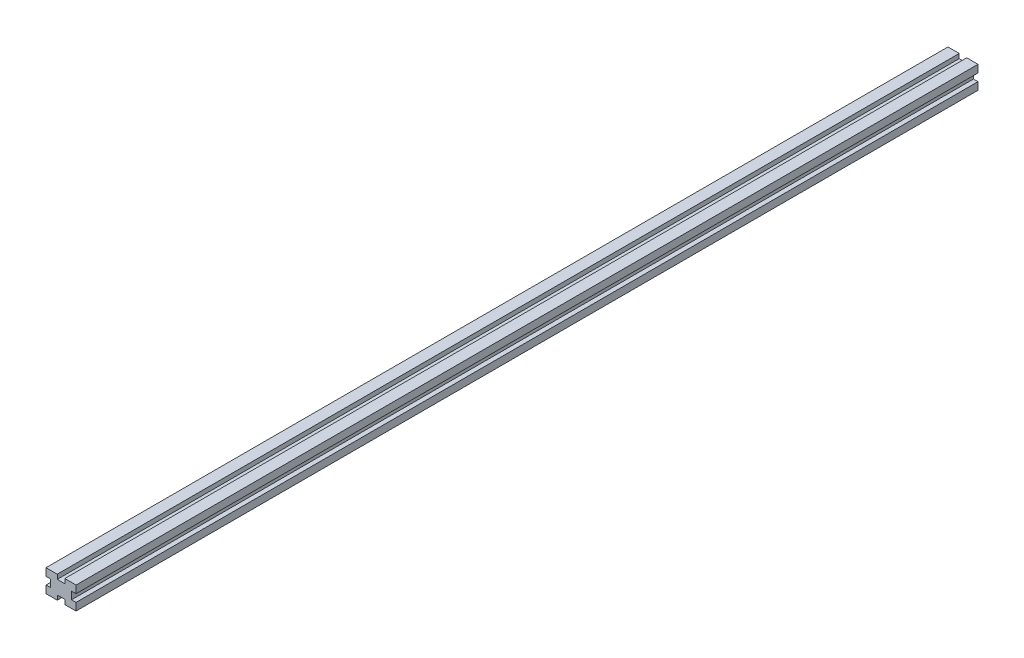
ISO-10303-21;
HEADER;
FILE_DESCRIPTION(('STEP AP214'),'2;1');
FILE_NAME('part.step','',(''),(''),'','','');
FILE_SCHEMA(('AUTOMOTIVE_DESIGN { 1 0 10303 214 1 1 1 1 }'));
ENDSEC;
DATA;
#1=APPLICATION_CONTEXT('core data for automotive mechanical design processes');
#2=APPLICATION_PROTOCOL_DEFINITION('international standard','automotive_design',2000,#1);
#3=PRODUCT_CONTEXT('',#1,'mechanical');
#4=PRODUCT('Part','Part','',(#3));
#5=PRODUCT_RELATED_PRODUCT_CATEGORY('part','',(#4));
#6=PRODUCT_DEFINITION_FORMATION('','',#4);
#7=PRODUCT_DEFINITION_CONTEXT('part definition',#1,'design');
#8=PRODUCT_DEFINITION('design','',#6,#7);
#9=PRODUCT_DEFINITION_SHAPE('','',#8);
#10=(LENGTH_UNIT() NAMED_UNIT(*) SI_UNIT(.MILLI.,.METRE.));
#11=(NAMED_UNIT(*) PLANE_ANGLE_UNIT() SI_UNIT($,.RADIAN.));
#12=(NAMED_UNIT(*) SI_UNIT($,.STERADIAN.) SOLID_ANGLE_UNIT());
#13=UNCERTAINTY_MEASURE_WITH_UNIT(LENGTH_MEASURE(1.E-05),#10,'distance_accuracy_value','');
#14=(GEOMETRIC_REPRESENTATION_CONTEXT(3) GLOBAL_UNCERTAINTY_ASSIGNED_CONTEXT((#13)) GLOBAL_UNIT_ASSIGNED_CONTEXT((#10,
#11,#12)) REPRESENTATION_CONTEXT('',''));
#15=CARTESIAN_POINT('',(0.,0.,0.));
#16=DIRECTION('',(0.,0.,1.));
#17=DIRECTION('',(1.,0.,0.));
#18=AXIS2_PLACEMENT_3D('',#15,#16,#17);
#19=CARTESIAN_POINT('',(0.,0.,600.));
#20=DIRECTION('',(1.,0.,0.));
#21=DIRECTION('',(0.,0.,-1.));
#22=AXIS2_PLACEMENT_3D('',#19,#20,#21);
#23=PLANE('',#22);
#24=DIRECTION('',(0.,-1.,0.));
#25=VECTOR('',#24,1.);
#26=CARTESIAN_POINT('',(0.,0.,0.));
#27=LINE('',#26,#25);
#28=CARTESIAN_POINT('',(0.,15.,0.));
#29=VERTEX_POINT('',#28);
#30=CARTESIAN_POINT('',(0.,10.,0.));
#31=VERTEX_POINT('',#30);
#32=EDGE_CURVE('E206',#29,#31,#27,.T.);
#33=ORIENTED_EDGE('',*,*,#32,.T.);
#34=DIRECTION('',(0.,0.,1.));
#35=VECTOR('',#34,1.);
#36=CARTESIAN_POINT('',(0.,10.,-100.));
#37=LINE('',#36,#35);
#38=CARTESIAN_POINT('',(0.,10.,600.));
#39=VERTEX_POINT('',#38);
#40=EDGE_CURVE('E325',#31,#39,#37,.T.);
#41=ORIENTED_EDGE('',*,*,#40,.T.);
#42=DIRECTION('',(0.,-1.,0.));
#43=VECTOR('',#42,1.);
#44=CARTESIAN_POINT('',(0.,0.,600.));
#45=LINE('',#44,#43);
#46=CARTESIAN_POINT('',(0.,15.,600.));
#47=VERTEX_POINT('',#46);
#48=EDGE_CURVE('E284',#47,#39,#45,.T.);
#49=ORIENTED_EDGE('',*,*,#48,.F.);
#50=DIRECTION('',(0.,0.,-1.));
#51=VECTOR('',#50,1.);
#52=CARTESIAN_POINT('',(0.,15.,600.));
#53=LINE('',#52,#51);
#54=EDGE_CURVE('E205',#47,#29,#53,.T.);
#55=ORIENTED_EDGE('',*,*,#54,.T.);
#56=EDGE_LOOP('',(#33,#41,#49,#55));
#57=FACE_BOUND('',#56,.T.);
#58=ADVANCED_FACE('F33',(#57),#23,.F.);
#59=CARTESIAN_POINT('',(0.,0.,600.));
#60=DIRECTION('',(0.,1.,0.));
#61=DIRECTION('',(0.,0.,1.));
#62=AXIS2_PLACEMENT_3D('',#59,#60,#61);
#63=PLANE('',#62);
#64=DIRECTION('',(1.,0.,0.));
#65=VECTOR('',#64,1.);
#66=CARTESIAN_POINT('',(0.,0.,600.));
#67=LINE('',#66,#65);
#68=CARTESIAN_POINT('',(12.5,0.,600.));
#69=VERTEX_POINT('',#68);
#70=CARTESIAN_POINT('',(20.,0.,600.));
#71=VERTEX_POINT('',#70);
#72=EDGE_CURVE('E199',#69,#71,#67,.T.);
#73=ORIENTED_EDGE('',*,*,#72,.F.);
#74=DIRECTION('',(0.,0.,1.));
#75=VECTOR('',#74,1.);
#76=CARTESIAN_POINT('',(12.5,0.,-100.));
#77=LINE('',#76,#75);
#78=CARTESIAN_POINT('',(12.5,0.,0.));
#79=VERTEX_POINT('',#78);
#80=EDGE_CURVE('E188',#79,#69,#77,.T.);
#81=ORIENTED_EDGE('',*,*,#80,.F.);
#82=DIRECTION('',(1.,0.,0.));
#83=VECTOR('',#82,1.);
#84=CARTESIAN_POINT('',(0.,0.,0.));
#85=LINE('',#84,#83);
#86=CARTESIAN_POINT('',(20.,0.,0.));
#87=VERTEX_POINT('',#86);
#88=EDGE_CURVE('E209',#79,#87,#85,.T.);
#89=ORIENTED_EDGE('',*,*,#88,.T.);
#90=DIRECTION('',(0.,0.,-1.));
#91=VECTOR('',#90,1.);
#92=CARTESIAN_POINT('',(20.,0.,600.));
#93=LINE('',#92,#91);
#94=EDGE_CURVE('E226',#71,#87,#93,.T.);
#95=ORIENTED_EDGE('',*,*,#94,.F.);
#96=EDGE_LOOP('',(#73,#81,#89,#95));
#97=FACE_BOUND('',#96,.T.);
#98=ADVANCED_FACE('F358',(#97),#63,.F.);
#99=CARTESIAN_POINT('',(20.,0.,600.));
#100=DIRECTION('',(-1.,0.,0.));
#101=DIRECTION('',(0.,0.,1.));
#102=AXIS2_PLACEMENT_3D('',#99,#100,#101);
#103=PLANE('',#102);
#104=DIRECTION('',(0.,1.,0.));
#105=VECTOR('',#104,1.);
#106=CARTESIAN_POINT('',(20.,0.,0.));
#107=LINE('',#106,#105);
#108=CARTESIAN_POINT('',(20.,5.,0.));
#109=VERTEX_POINT('',#108);
#110=EDGE_CURVE('E215',#87,#109,#107,.T.);
#111=ORIENTED_EDGE('',*,*,#110,.T.);
#112=DIRECTION('',(0.,0.,1.));
#113=VECTOR('',#112,1.);
#114=CARTESIAN_POINT('',(20.,5.,-100.));
#115=LINE('',#114,#113);
#116=CARTESIAN_POINT('',(20.,5.,600.));
#117=VERTEX_POINT('',#116);
#118=EDGE_CURVE('E334',#109,#117,#115,.T.);
#119=ORIENTED_EDGE('',*,*,#118,.T.);
#120=DIRECTION('',(0.,1.,0.));
#121=VECTOR('',#120,1.);
#122=CARTESIAN_POINT('',(20.,0.,600.));
#123=LINE('',#122,#121);
#124=EDGE_CURVE('E194',#71,#117,#123,.T.);
#125=ORIENTED_EDGE('',*,*,#124,.F.);
#126=ORIENTED_EDGE('',*,*,#94,.T.);
#127=EDGE_LOOP('',(#111,#119,#125,#126));
#128=FACE_BOUND('',#127,.T.);
#129=ADVANCED_FACE('F361',(#128),#103,.F.);
#130=CARTESIAN_POINT('',(0.,15.,600.));
#131=DIRECTION('',(0.,-1.,0.));
#132=DIRECTION('',(0.,0.,-1.));
#133=AXIS2_PLACEMENT_3D('',#130,#131,#132);
#134=PLANE('',#133);
#135=DIRECTION('',(-1.,0.,0.));
#136=VECTOR('',#135,1.);
#137=CARTESIAN_POINT('',(0.,15.,600.));
#138=LINE('',#137,#136);
#139=CARTESIAN_POINT('',(7.5,15.,600.));
#140=VERTEX_POINT('',#139);
#141=EDGE_CURVE('E197',#140,#47,#138,.T.);
#142=ORIENTED_EDGE('',*,*,#141,.F.);
#143=DIRECTION('',(0.,0.,1.));
#144=VECTOR('',#143,1.);
#145=CARTESIAN_POINT('',(7.5,15.,-100.));
#146=LINE('',#145,#144);
#147=CARTESIAN_POINT('',(7.5,15.,0.));
#148=VERTEX_POINT('',#147);
#149=EDGE_CURVE('E281',#148,#140,#146,.T.);
#150=ORIENTED_EDGE('',*,*,#149,.F.);
#151=DIRECTION('',(-1.,0.,0.));
#152=VECTOR('',#151,1.);
#153=CARTESIAN_POINT('',(0.,15.,0.));
#154=LINE('',#153,#152);
#155=EDGE_CURVE('E218',#148,#29,#154,.T.);
#156=ORIENTED_EDGE('',*,*,#155,.T.);
#157=ORIENTED_EDGE('',*,*,#54,.F.);
#158=EDGE_LOOP('',(#142,#150,#156,#157));
#159=FACE_BOUND('',#158,.T.);
#160=ADVANCED_FACE('F384',(#159),#134,.F.);
#161=CARTESIAN_POINT('',(0.,5.,600.));
#162=VERTEX_POINT('',#161);
#163=CARTESIAN_POINT('',(0.,0.,600.));
#164=VERTEX_POINT('',#163);
#165=EDGE_CURVE('E222',#162,#164,#45,.T.);
#166=ORIENTED_EDGE('',*,*,#165,.F.);
#167=DIRECTION('',(0.,0.,1.));
#168=VECTOR('',#167,1.);
#169=CARTESIAN_POINT('',(0.,5.,-100.));
#170=LINE('',#169,#168);
#171=CARTESIAN_POINT('',(0.,5.,0.));
#172=VERTEX_POINT('',#171);
#173=EDGE_CURVE('E304',#172,#162,#170,.T.);
#174=ORIENTED_EDGE('',*,*,#173,.F.);
#175=CARTESIAN_POINT('',(0.,0.,0.));
#176=VERTEX_POINT('',#175);
#177=EDGE_CURVE('E210',#172,#176,#27,.T.);
#178=ORIENTED_EDGE('',*,*,#177,.T.);
#179=DIRECTION('',(0.,0.,-1.));
#180=VECTOR('',#179,1.);
#181=CARTESIAN_POINT('',(0.,0.,600.));
#182=LINE('',#181,#180);
#183=EDGE_CURVE('E229',#164,#176,#182,.T.);
#184=ORIENTED_EDGE('',*,*,#183,.F.);
#185=EDGE_LOOP('',(#166,#174,#178,#184));
#186=FACE_BOUND('',#185,.T.);
#187=ADVANCED_FACE('F35',(#186),#23,.F.);
#188=CARTESIAN_POINT('',(7.5,0.,0.));
#189=VERTEX_POINT('',#188);
#190=EDGE_CURVE('E211',#176,#189,#85,.T.);
#191=ORIENTED_EDGE('',*,*,#190,.T.);
#192=DIRECTION('',(0.,0.,1.));
#193=VECTOR('',#192,1.);
#194=CARTESIAN_POINT('',(7.5,0.,-100.));
#195=LINE('',#194,#193);
#196=CARTESIAN_POINT('',(7.5,0.,600.));
#197=VERTEX_POINT('',#196);
#198=EDGE_CURVE('E301',#189,#197,#195,.T.);
#199=ORIENTED_EDGE('',*,*,#198,.T.);
#200=EDGE_CURVE('E195',#164,#197,#67,.T.);
#201=ORIENTED_EDGE('',*,*,#200,.F.);
#202=ORIENTED_EDGE('',*,*,#183,.T.);
#203=EDGE_LOOP('',(#191,#199,#201,#202));
#204=FACE_BOUND('',#203,.T.);
#205=ADVANCED_FACE('F300',(#204),#63,.F.);
#206=CARTESIAN_POINT('',(20.,10.,600.));
#207=VERTEX_POINT('',#206);
#208=CARTESIAN_POINT('',(20.,15.,600.));
#209=VERTEX_POINT('',#208);
#210=EDGE_CURVE('E183',#207,#209,#123,.T.);
#211=ORIENTED_EDGE('',*,*,#210,.F.);
#212=DIRECTION('',(0.,0.,1.));
#213=VECTOR('',#212,1.);
#214=CARTESIAN_POINT('',(20.,10.,-100.));
#215=LINE('',#214,#213);
#216=CARTESIAN_POINT('',(20.,10.,0.));
#217=VERTEX_POINT('',#216);
#218=EDGE_CURVE('E167',#217,#207,#215,.T.);
#219=ORIENTED_EDGE('',*,*,#218,.F.);
#220=CARTESIAN_POINT('',(20.,15.,0.));
#221=VERTEX_POINT('',#220);
#222=EDGE_CURVE('E214',#217,#221,#107,.T.);
#223=ORIENTED_EDGE('',*,*,#222,.T.);
#224=DIRECTION('',(0.,0.,-1.));
#225=VECTOR('',#224,1.);
#226=CARTESIAN_POINT('',(20.,15.,600.));
#227=LINE('',#226,#225);
#228=EDGE_CURVE('E192',#209,#221,#227,.T.);
#229=ORIENTED_EDGE('',*,*,#228,.F.);
#230=EDGE_LOOP('',(#211,#219,#223,#229));
#231=FACE_BOUND('',#230,.T.);
#232=ADVANCED_FACE('F190',(#231),#103,.F.);
#233=CARTESIAN_POINT('',(12.5,15.,0.));
#234=VERTEX_POINT('',#233);
#235=EDGE_CURVE('E219',#221,#234,#154,.T.);
#236=ORIENTED_EDGE('',*,*,#235,.T.);
#237=DIRECTION('',(0.,0.,1.));
#238=VECTOR('',#237,1.);
#239=CARTESIAN_POINT('',(12.5,15.,-100.));
#240=LINE('',#239,#238);
#241=CARTESIAN_POINT('',(12.5,15.,600.));
#242=VERTEX_POINT('',#241);
#243=EDGE_CURVE('E265',#234,#242,#240,.T.);
#244=ORIENTED_EDGE('',*,*,#243,.T.);
#245=EDGE_CURVE('E203',#209,#242,#138,.T.);
#246=ORIENTED_EDGE('',*,*,#245,.F.);
#247=ORIENTED_EDGE('',*,*,#228,.T.);
#248=EDGE_LOOP('',(#236,#244,#246,#247));
#249=FACE_BOUND('',#248,.T.);
#250=ADVANCED_FACE('F263',(#249),#134,.F.);
#251=CARTESIAN_POINT('',(0.,0.,600.));
#252=DIRECTION('',(0.,0.,-1.));
#253=DIRECTION('',(-1.,0.,0.));
#254=AXIS2_PLACEMENT_3D('',#251,#252,#253);
#255=PLANE('',#254);
#256=ORIENTED_EDGE('',*,*,#124,.T.);
#257=DIRECTION('',(1.,0.,0.));
#258=VECTOR('',#257,1.);
#259=CARTESIAN_POINT('',(20.,5.,600.));
#260=LINE('',#259,#258);
#261=CARTESIAN_POINT('',(17.,5.,600.));
#262=VERTEX_POINT('',#261);
#263=EDGE_CURVE('E177',#262,#117,#260,.T.);
#264=ORIENTED_EDGE('',*,*,#263,.F.);
#265=DIRECTION('',(0.,-1.,0.));
#266=VECTOR('',#265,1.);
#267=CARTESIAN_POINT('',(17.,10.,600.));
#268=LINE('',#267,#266);
#269=CARTESIAN_POINT('',(17.,10.,600.));
#270=VERTEX_POINT('',#269);
#271=EDGE_CURVE('E187',#270,#262,#268,.T.);
#272=ORIENTED_EDGE('',*,*,#271,.F.);
#273=DIRECTION('',(-1.,0.,0.));
#274=VECTOR('',#273,1.);
#275=CARTESIAN_POINT('',(20.,10.,600.));
#276=LINE('',#275,#274);
#277=EDGE_CURVE('E170',#207,#270,#276,.T.);
#278=ORIENTED_EDGE('',*,*,#277,.F.);
#279=ORIENTED_EDGE('',*,*,#210,.T.);
#280=ORIENTED_EDGE('',*,*,#245,.T.);
#281=DIRECTION('',(0.,1.,0.));
#282=VECTOR('',#281,1.);
#283=CARTESIAN_POINT('',(12.5,15.,600.));
#284=LINE('',#283,#282);
#285=CARTESIAN_POINT('',(12.5,12.,600.));
#286=VERTEX_POINT('',#285);
#287=EDGE_CURVE('E268',#286,#242,#284,.T.);
#288=ORIENTED_EDGE('',*,*,#287,.F.);
#289=DIRECTION('',(1.,0.,0.));
#290=VECTOR('',#289,1.);
#291=CARTESIAN_POINT('',(7.5,12.,600.));
#292=LINE('',#291,#290);
#293=CARTESIAN_POINT('',(7.5,12.,600.));
#294=VERTEX_POINT('',#293);
#295=EDGE_CURVE('E271',#294,#286,#292,.T.);
#296=ORIENTED_EDGE('',*,*,#295,.F.);
#297=DIRECTION('',(0.,-1.,0.));
#298=VECTOR('',#297,1.);
#299=CARTESIAN_POINT('',(7.5,15.,600.));
#300=LINE('',#299,#298);
#301=EDGE_CURVE('E277',#140,#294,#300,.T.);
#302=ORIENTED_EDGE('',*,*,#301,.F.);
#303=ORIENTED_EDGE('',*,*,#141,.T.);
#304=ORIENTED_EDGE('',*,*,#48,.T.);
#305=DIRECTION('',(-1.,0.,0.));
#306=VECTOR('',#305,1.);
#307=CARTESIAN_POINT('',(0.,10.,600.));
#308=LINE('',#307,#306);
#309=CARTESIAN_POINT('',(3.,10.,600.));
#310=VERTEX_POINT('',#309);
#311=EDGE_CURVE('E323',#310,#39,#308,.T.);
#312=ORIENTED_EDGE('',*,*,#311,.F.);
#313=DIRECTION('',(0.,1.,0.));
#314=VECTOR('',#313,1.);
#315=CARTESIAN_POINT('',(3.,5.,600.));
#316=LINE('',#315,#314);
#317=CARTESIAN_POINT('',(3.,5.,600.));
#318=VERTEX_POINT('',#317);
#319=EDGE_CURVE('E320',#318,#310,#316,.T.);
#320=ORIENTED_EDGE('',*,*,#319,.F.);
#321=DIRECTION('',(1.,0.,0.));
#322=VECTOR('',#321,1.);
#323=CARTESIAN_POINT('',(0.,5.,600.));
#324=LINE('',#323,#322);
#325=EDGE_CURVE('E294',#162,#318,#324,.T.);
#326=ORIENTED_EDGE('',*,*,#325,.F.);
#327=ORIENTED_EDGE('',*,*,#165,.T.);
#328=ORIENTED_EDGE('',*,*,#200,.T.);
#329=DIRECTION('',(0.,-1.,0.));
#330=VECTOR('',#329,1.);
#331=CARTESIAN_POINT('',(7.5,0.,600.));
#332=LINE('',#331,#330);
#333=CARTESIAN_POINT('',(7.5,3.,600.));
#334=VERTEX_POINT('',#333);
#335=EDGE_CURVE('E311',#334,#197,#332,.T.);
#336=ORIENTED_EDGE('',*,*,#335,.F.);
#337=DIRECTION('',(-1.,0.,0.));
#338=VECTOR('',#337,1.);
#339=CARTESIAN_POINT('',(12.5,3.,600.));
#340=LINE('',#339,#338);
#341=CARTESIAN_POINT('',(12.5,3.,600.));
#342=VERTEX_POINT('',#341);
#343=EDGE_CURVE('E348',#342,#334,#340,.T.);
#344=ORIENTED_EDGE('',*,*,#343,.F.);
#345=DIRECTION('',(0.,1.,0.));
#346=VECTOR('',#345,1.);
#347=CARTESIAN_POINT('',(12.5,0.,600.));
#348=LINE('',#347,#346);
#349=EDGE_CURVE('E328',#69,#342,#348,.T.);
#350=ORIENTED_EDGE('',*,*,#349,.F.);
#351=ORIENTED_EDGE('',*,*,#72,.T.);
#352=EDGE_LOOP('',(#256,#264,#272,#278,#279,#280,#288,#296,#302,#303,#304,#312,#320,#326,#327,
#328,#336,#344,#350,#351));
#353=FACE_BOUND('',#352,.T.);
#354=ADVANCED_FACE('F181',(#353),#255,.F.);
#355=CARTESIAN_POINT('',(0.,0.,0.));
#356=DIRECTION('',(0.,0.,-1.));
#357=DIRECTION('',(-1.,0.,0.));
#358=AXIS2_PLACEMENT_3D('',#355,#356,#357);
#359=PLANE('',#358);
#360=DIRECTION('',(-1.,0.,0.));
#361=VECTOR('',#360,1.);
#362=CARTESIAN_POINT('',(0.,4.99999999999999,0.));
#363=LINE('',#362,#361);
#364=CARTESIAN_POINT('',(17.,5.,0.));
#365=VERTEX_POINT('',#364);
#366=EDGE_CURVE('E11',#109,#365,#363,.T.);
#367=ORIENTED_EDGE('',*,*,#366,.F.);
#368=ORIENTED_EDGE('',*,*,#110,.F.);
#369=ORIENTED_EDGE('',*,*,#88,.F.);
#370=DIRECTION('',(0.,-1.,0.));
#371=VECTOR('',#370,1.);
#372=CARTESIAN_POINT('',(12.5,0.,0.));
#373=LINE('',#372,#371);
#374=CARTESIAN_POINT('',(12.5,3.,0.));
#375=VERTEX_POINT('',#374);
#376=EDGE_CURVE('E250',#375,#79,#373,.T.);
#377=ORIENTED_EDGE('',*,*,#376,.F.);
#378=DIRECTION('',(1.,0.,0.));
#379=VECTOR('',#378,1.);
#380=CARTESIAN_POINT('',(0.,3.,0.));
#381=LINE('',#380,#379);
#382=CARTESIAN_POINT('',(7.5,3.,0.));
#383=VERTEX_POINT('',#382);
#384=EDGE_CURVE('E246',#383,#375,#381,.T.);
#385=ORIENTED_EDGE('',*,*,#384,.F.);
#386=DIRECTION('',(0.,1.,0.));
#387=VECTOR('',#386,1.);
#388=CARTESIAN_POINT('',(7.5,0.,0.));
#389=LINE('',#388,#387);
#390=EDGE_CURVE('E248',#189,#383,#389,.T.);
#391=ORIENTED_EDGE('',*,*,#390,.F.);
#392=ORIENTED_EDGE('',*,*,#190,.F.);
#393=ORIENTED_EDGE('',*,*,#177,.F.);
#394=DIRECTION('',(-1.,0.,0.));
#395=VECTOR('',#394,1.);
#396=CARTESIAN_POINT('',(0.,5.,0.));
#397=LINE('',#396,#395);
#398=CARTESIAN_POINT('',(3.,5.,0.));
#399=VERTEX_POINT('',#398);
#400=EDGE_CURVE('E239',#399,#172,#397,.T.);
#401=ORIENTED_EDGE('',*,*,#400,.F.);
#402=DIRECTION('',(0.,-1.,0.));
#403=VECTOR('',#402,1.);
#404=CARTESIAN_POINT('',(3.,0.,0.));
#405=LINE('',#404,#403);
#406=CARTESIAN_POINT('',(3.,10.,0.));
#407=VERTEX_POINT('',#406);
#408=EDGE_CURVE('E241',#407,#399,#405,.T.);
#409=ORIENTED_EDGE('',*,*,#408,.F.);
#410=DIRECTION('',(1.,0.,0.));
#411=VECTOR('',#410,1.);
#412=CARTESIAN_POINT('',(0.,10.,0.));
#413=LINE('',#412,#411);
#414=EDGE_CURVE('E244',#31,#407,#413,.T.);
#415=ORIENTED_EDGE('',*,*,#414,.F.);
#416=ORIENTED_EDGE('',*,*,#32,.F.);
#417=ORIENTED_EDGE('',*,*,#155,.F.);
#418=DIRECTION('',(0.,1.,0.));
#419=VECTOR('',#418,1.);
#420=CARTESIAN_POINT('',(7.5,0.,0.));
#421=LINE('',#420,#419);
#422=CARTESIAN_POINT('',(7.5,12.,0.));
#423=VERTEX_POINT('',#422);
#424=EDGE_CURVE('E237',#423,#148,#421,.T.);
#425=ORIENTED_EDGE('',*,*,#424,.F.);
#426=DIRECTION('',(-1.,0.,0.));
#427=VECTOR('',#426,1.);
#428=CARTESIAN_POINT('',(0.,12.,0.));
#429=LINE('',#428,#427);
#430=CARTESIAN_POINT('',(12.5,12.,0.));
#431=VERTEX_POINT('',#430);
#432=EDGE_CURVE('E232',#431,#423,#429,.T.);
#433=ORIENTED_EDGE('',*,*,#432,.F.);
#434=DIRECTION('',(0.,-1.,0.));
#435=VECTOR('',#434,1.);
#436=CARTESIAN_POINT('',(12.5,0.,0.));
#437=LINE('',#436,#435);
#438=EDGE_CURVE('E234',#234,#431,#437,.T.);
#439=ORIENTED_EDGE('',*,*,#438,.F.);
#440=ORIENTED_EDGE('',*,*,#235,.F.);
#441=ORIENTED_EDGE('',*,*,#222,.F.);
#442=DIRECTION('',(1.,0.,0.));
#443=VECTOR('',#442,1.);
#444=CARTESIAN_POINT('',(0.,10.,0.));
#445=LINE('',#444,#443);
#446=CARTESIAN_POINT('',(17.,10.,0.));
#447=VERTEX_POINT('',#446);
#448=EDGE_CURVE('E173',#447,#217,#445,.T.);
#449=ORIENTED_EDGE('',*,*,#448,.F.);
#450=DIRECTION('',(0.,1.,0.));
#451=VECTOR('',#450,1.);
#452=CARTESIAN_POINT('',(17.,0.,0.));
#453=LINE('',#452,#451);
#454=EDGE_CURVE('E41',#365,#447,#453,.T.);
#455=ORIENTED_EDGE('',*,*,#454,.F.);
#456=EDGE_LOOP('',(#367,#368,#369,#377,#385,#391,#392,#393,#401,#409,#415,#416,#417,#425,#433,
#439,#440,#441,#449,#455));
#457=FACE_BOUND('',#456,.T.);
#458=ADVANCED_FACE('F259',(#457),#359,.T.);
#459=CARTESIAN_POINT('',(7.5,15.,-100.));
#460=DIRECTION('',(-1.,0.,0.));
#461=DIRECTION('',(0.,0.,1.));
#462=AXIS2_PLACEMENT_3D('',#459,#460,#461);
#463=PLANE('',#462);
#464=ORIENTED_EDGE('',*,*,#424,.T.);
#465=ORIENTED_EDGE('',*,*,#149,.T.);
#466=ORIENTED_EDGE('',*,*,#301,.T.);
#467=DIRECTION('',(0.,0.,1.));
#468=VECTOR('',#467,1.);
#469=CARTESIAN_POINT('',(7.5,12.,-100.));
#470=LINE('',#469,#468);
#471=EDGE_CURVE('E273',#423,#294,#470,.T.);
#472=ORIENTED_EDGE('',*,*,#471,.F.);
#473=EDGE_LOOP('',(#464,#465,#466,#472));
#474=FACE_BOUND('',#473,.T.);
#475=ADVANCED_FACE('F439',(#474),#463,.F.);
#476=CARTESIAN_POINT('',(12.5,15.,-100.));
#477=DIRECTION('',(1.,0.,0.));
#478=DIRECTION('',(0.,0.,-1.));
#479=AXIS2_PLACEMENT_3D('',#476,#477,#478);
#480=PLANE('',#479);
#481=ORIENTED_EDGE('',*,*,#438,.T.);
#482=DIRECTION('',(0.,0.,1.));
#483=VECTOR('',#482,1.);
#484=CARTESIAN_POINT('',(12.5,12.,-100.));
#485=LINE('',#484,#483);
#486=EDGE_CURVE('E275',#431,#286,#485,.T.);
#487=ORIENTED_EDGE('',*,*,#486,.T.);
#488=ORIENTED_EDGE('',*,*,#287,.T.);
#489=ORIENTED_EDGE('',*,*,#243,.F.);
#490=EDGE_LOOP('',(#481,#487,#488,#489));
#491=FACE_BOUND('',#490,.T.);
#492=ADVANCED_FACE('F445',(#491),#480,.F.);
#493=CARTESIAN_POINT('',(7.5,12.,-100.));
#494=DIRECTION('',(0.,-1.,0.));
#495=DIRECTION('',(0.,0.,-1.));
#496=AXIS2_PLACEMENT_3D('',#493,#494,#495);
#497=PLANE('',#496);
#498=ORIENTED_EDGE('',*,*,#432,.T.);
#499=ORIENTED_EDGE('',*,*,#471,.T.);
#500=ORIENTED_EDGE('',*,*,#295,.T.);
#501=ORIENTED_EDGE('',*,*,#486,.F.);
#502=EDGE_LOOP('',(#498,#499,#500,#501));
#503=FACE_BOUND('',#502,.T.);
#504=ADVANCED_FACE('F454',(#503),#497,.F.);
#505=CARTESIAN_POINT('',(0.,10.,-100.));
#506=DIRECTION('',(0.,1.,0.));
#507=DIRECTION('',(-1.,0.,0.));
#508=AXIS2_PLACEMENT_3D('',#505,#506,#507);
#509=PLANE('',#508);
#510=ORIENTED_EDGE('',*,*,#414,.T.);
#511=DIRECTION('',(0.,0.,1.));
#512=VECTOR('',#511,1.);
#513=CARTESIAN_POINT('',(3.,10.,-100.));
#514=LINE('',#513,#512);
#515=EDGE_CURVE('E329',#407,#310,#514,.T.);
#516=ORIENTED_EDGE('',*,*,#515,.T.);
#517=ORIENTED_EDGE('',*,*,#311,.T.);
#518=ORIENTED_EDGE('',*,*,#40,.F.);
#519=EDGE_LOOP('',(#510,#516,#517,#518));
#520=FACE_BOUND('',#519,.T.);
#521=ADVANCED_FACE('F462',(#520),#509,.F.);
#522=CARTESIAN_POINT('',(3.,5.,-100.));
#523=DIRECTION('',(1.,0.,0.));
#524=DIRECTION('',(0.,0.,-1.));
#525=AXIS2_PLACEMENT_3D('',#522,#523,#524);
#526=PLANE('',#525);
#527=ORIENTED_EDGE('',*,*,#408,.T.);
#528=DIRECTION('',(0.,0.,1.));
#529=VECTOR('',#528,1.);
#530=CARTESIAN_POINT('',(3.,5.,-100.));
#531=LINE('',#530,#529);
#532=EDGE_CURVE('E331',#399,#318,#531,.T.);
#533=ORIENTED_EDGE('',*,*,#532,.T.);
#534=ORIENTED_EDGE('',*,*,#319,.T.);
#535=ORIENTED_EDGE('',*,*,#515,.F.);
#536=EDGE_LOOP('',(#527,#533,#534,#535));
#537=FACE_BOUND('',#536,.T.);
#538=ADVANCED_FACE('F373',(#537),#526,.F.);
#539=CARTESIAN_POINT('',(0.,5.,-100.));
#540=DIRECTION('',(0.,-1.,0.));
#541=DIRECTION('',(0.,0.,-1.));
#542=AXIS2_PLACEMENT_3D('',#539,#540,#541);
#543=PLANE('',#542);
#544=ORIENTED_EDGE('',*,*,#400,.T.);
#545=ORIENTED_EDGE('',*,*,#173,.T.);
#546=ORIENTED_EDGE('',*,*,#325,.T.);
#547=ORIENTED_EDGE('',*,*,#532,.F.);
#548=EDGE_LOOP('',(#544,#545,#546,#547));
#549=FACE_BOUND('',#548,.T.);
#550=ADVANCED_FACE('F366',(#549),#543,.F.);
#551=CARTESIAN_POINT('',(12.5,0.,-100.));
#552=DIRECTION('',(1.,0.,0.));
#553=DIRECTION('',(0.,0.,-1.));
#554=AXIS2_PLACEMENT_3D('',#551,#552,#553);
#555=PLANE('',#554);
#556=ORIENTED_EDGE('',*,*,#376,.T.);
#557=ORIENTED_EDGE('',*,*,#80,.T.);
#558=ORIENTED_EDGE('',*,*,#349,.T.);
#559=DIRECTION('',(0.,0.,1.));
#560=VECTOR('',#559,1.);
#561=CARTESIAN_POINT('',(12.5,3.,-100.));
#562=LINE('',#561,#560);
#563=EDGE_CURVE('E314',#375,#342,#562,.T.);
#564=ORIENTED_EDGE('',*,*,#563,.F.);
#565=EDGE_LOOP('',(#556,#557,#558,#564));
#566=FACE_BOUND('',#565,.T.);
#567=ADVANCED_FACE('F364',(#566),#555,.F.);
#568=CARTESIAN_POINT('',(7.5,0.,-100.));
#569=DIRECTION('',(-1.,0.,0.));
#570=DIRECTION('',(0.,0.,1.));
#571=AXIS2_PLACEMENT_3D('',#568,#569,#570);
#572=PLANE('',#571);
#573=ORIENTED_EDGE('',*,*,#390,.T.);
#574=DIRECTION('',(0.,0.,1.));
#575=VECTOR('',#574,1.);
#576=CARTESIAN_POINT('',(7.5,3.,-100.));
#577=LINE('',#576,#575);
#578=EDGE_CURVE('E56',#383,#334,#577,.T.);
#579=ORIENTED_EDGE('',*,*,#578,.T.);
#580=ORIENTED_EDGE('',*,*,#335,.T.);
#581=ORIENTED_EDGE('',*,*,#198,.F.);
#582=EDGE_LOOP('',(#573,#579,#580,#581));
#583=FACE_BOUND('',#582,.T.);
#584=ADVANCED_FACE('F310',(#583),#572,.F.);
#585=CARTESIAN_POINT('',(12.5,3.,-100.));
#586=DIRECTION('',(0.,1.,0.));
#587=DIRECTION('',(0.,0.,1.));
#588=AXIS2_PLACEMENT_3D('',#585,#586,#587);
#589=PLANE('',#588);
#590=ORIENTED_EDGE('',*,*,#384,.T.);
#591=ORIENTED_EDGE('',*,*,#563,.T.);
#592=ORIENTED_EDGE('',*,*,#343,.T.);
#593=ORIENTED_EDGE('',*,*,#578,.F.);
#594=EDGE_LOOP('',(#590,#591,#592,#593));
#595=FACE_BOUND('',#594,.T.);
#596=ADVANCED_FACE('F350',(#595),#589,.F.);
#597=CARTESIAN_POINT('',(20.,5.,-100.));
#598=DIRECTION('',(0.,-1.,0.));
#599=DIRECTION('',(1.,0.,0.));
#600=AXIS2_PLACEMENT_3D('',#597,#598,#599);
#601=PLANE('',#600);
#602=ORIENTED_EDGE('',*,*,#366,.T.);
#603=DIRECTION('',(0.,0.,1.));
#604=VECTOR('',#603,1.);
#605=CARTESIAN_POINT('',(17.,5.,-100.));
#606=LINE('',#605,#604);
#607=EDGE_CURVE('E256',#365,#262,#606,.T.);
#608=ORIENTED_EDGE('',*,*,#607,.T.);
#609=ORIENTED_EDGE('',*,*,#263,.T.);
#610=ORIENTED_EDGE('',*,*,#118,.F.);
#611=EDGE_LOOP('',(#602,#608,#609,#610));
#612=FACE_BOUND('',#611,.T.);
#613=ADVANCED_FACE('F363',(#612),#601,.F.);
#614=CARTESIAN_POINT('',(17.,10.,-100.));
#615=DIRECTION('',(-1.,0.,0.));
#616=DIRECTION('',(0.,0.,1.));
#617=AXIS2_PLACEMENT_3D('',#614,#615,#616);
#618=PLANE('',#617);
#619=ORIENTED_EDGE('',*,*,#454,.T.);
#620=DIRECTION('',(0.,0.,1.));
#621=VECTOR('',#620,1.);
#622=CARTESIAN_POINT('',(17.,10.,-100.));
#623=LINE('',#622,#621);
#624=EDGE_CURVE('E48',#447,#270,#623,.T.);
#625=ORIENTED_EDGE('',*,*,#624,.T.);
#626=ORIENTED_EDGE('',*,*,#271,.T.);
#627=ORIENTED_EDGE('',*,*,#607,.F.);
#628=EDGE_LOOP('',(#619,#625,#626,#627));
#629=FACE_BOUND('',#628,.T.);
#630=ADVANCED_FACE('F255',(#629),#618,.F.);
#631=CARTESIAN_POINT('',(20.,10.,-100.));
#632=DIRECTION('',(0.,1.,0.));
#633=DIRECTION('',(0.,0.,1.));
#634=AXIS2_PLACEMENT_3D('',#631,#632,#633);
#635=PLANE('',#634);
#636=ORIENTED_EDGE('',*,*,#448,.T.);
#637=ORIENTED_EDGE('',*,*,#218,.T.);
#638=ORIENTED_EDGE('',*,*,#277,.T.);
#639=ORIENTED_EDGE('',*,*,#624,.F.);
#640=EDGE_LOOP('',(#636,#637,#638,#639));
#641=FACE_BOUND('',#640,.T.);
#642=ADVANCED_FACE('F169',(#641),#635,.F.);
#643=CLOSED_SHELL('',(#58,#98,#129,#160,#187,#205,#232,#250,#354,#458,#475,#492,#504,#521,#538,
#550,#567,#584,#596,#613,#630,#642));
#644=MANIFOLD_SOLID_BREP('B2',#643);
#645=ADVANCED_BREP_SHAPE_REPRESENTATION('',(#18,#644),#14);
#646=SHAPE_DEFINITION_REPRESENTATION(#9,#645);
ENDSEC;
END-ISO-10303-21;
